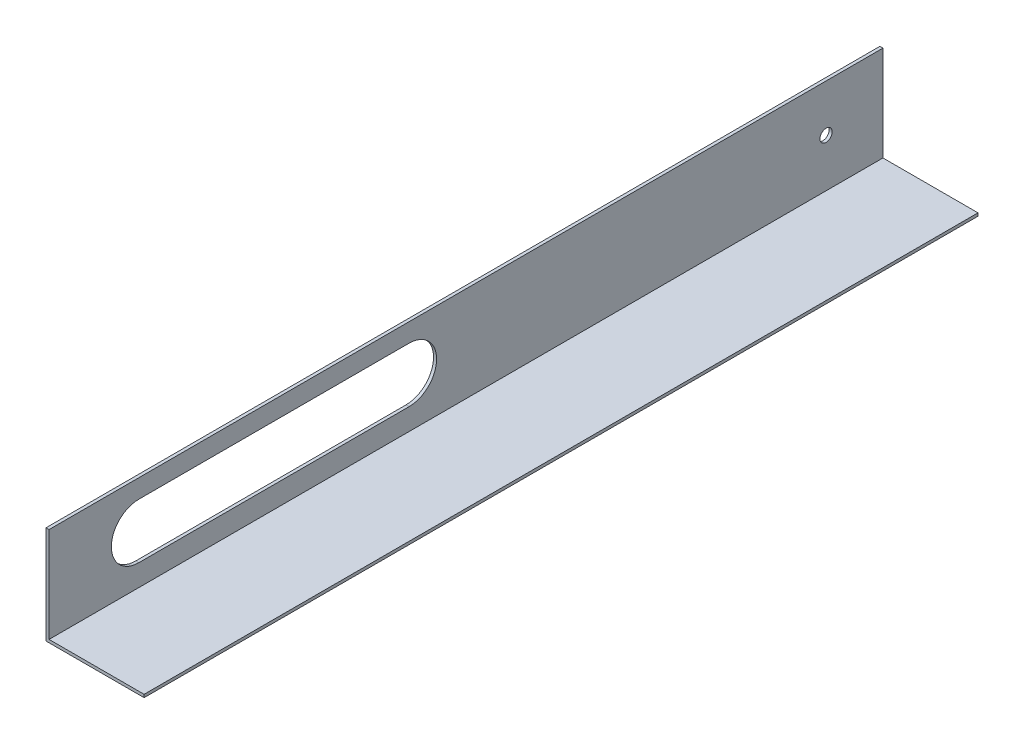
ISO-10303-21;
HEADER;
FILE_DESCRIPTION(('STEP AP214'),'2;1');
FILE_NAME('part.step','',(''),(''),'','','');
FILE_SCHEMA(('AUTOMOTIVE_DESIGN { 1 0 10303 214 1 1 1 1 }'));
ENDSEC;
DATA;
#1=APPLICATION_CONTEXT('core data for automotive mechanical design processes');
#2=APPLICATION_PROTOCOL_DEFINITION('international standard','automotive_design',2000,#1);
#3=PRODUCT_CONTEXT('',#1,'mechanical');
#4=PRODUCT('Part','Part','',(#3));
#5=PRODUCT_RELATED_PRODUCT_CATEGORY('part','',(#4));
#6=PRODUCT_DEFINITION_FORMATION('','',#4);
#7=PRODUCT_DEFINITION_CONTEXT('part definition',#1,'design');
#8=PRODUCT_DEFINITION('design','',#6,#7);
#9=PRODUCT_DEFINITION_SHAPE('','',#8);
#10=(LENGTH_UNIT() NAMED_UNIT(*) SI_UNIT(.MILLI.,.METRE.));
#11=(NAMED_UNIT(*) PLANE_ANGLE_UNIT() SI_UNIT($,.RADIAN.));
#12=(NAMED_UNIT(*) SI_UNIT($,.STERADIAN.) SOLID_ANGLE_UNIT());
#13=UNCERTAINTY_MEASURE_WITH_UNIT(LENGTH_MEASURE(1.E-05),#10,'distance_accuracy_value','');
#14=(GEOMETRIC_REPRESENTATION_CONTEXT(3) GLOBAL_UNCERTAINTY_ASSIGNED_CONTEXT((#13)) GLOBAL_UNIT_ASSIGNED_CONTEXT((#10,
#11,#12)) REPRESENTATION_CONTEXT('',''));
#15=CARTESIAN_POINT('',(0.,0.,0.));
#16=DIRECTION('',(0.,0.,1.));
#17=DIRECTION('',(1.,0.,0.));
#18=AXIS2_PLACEMENT_3D('',#15,#16,#17);
#19=CARTESIAN_POINT('',(100.0125,0.,431.8));
#20=DIRECTION('',(0.,1.,0.));
#21=DIRECTION('',(-1.,0.,0.));
#22=AXIS2_PLACEMENT_3D('',#19,#20,#21);
#23=PLANE('',#22);
#24=DIRECTION('',(1.,0.,0.));
#25=VECTOR('',#24,1.);
#26=CARTESIAN_POINT('',(100.0125,0.,0.));
#27=LINE('',#26,#25);
#28=CARTESIAN_POINT('',(49.2125,0.,0.));
#29=VERTEX_POINT('',#28);
#30=CARTESIAN_POINT('',(100.0125,0.,0.));
#31=VERTEX_POINT('',#30);
#32=EDGE_CURVE('E159',#29,#31,#27,.T.);
#33=ORIENTED_EDGE('',*,*,#32,.T.);
#34=DIRECTION('',(0.,0.,-1.));
#35=VECTOR('',#34,1.);
#36=CARTESIAN_POINT('',(100.0125,0.,431.8));
#37=LINE('',#36,#35);
#38=CARTESIAN_POINT('',(100.0125,0.,431.8));
#39=VERTEX_POINT('',#38);
#40=EDGE_CURVE('E181',#39,#31,#37,.T.);
#41=ORIENTED_EDGE('',*,*,#40,.F.);
#42=DIRECTION('',(1.,0.,0.));
#43=VECTOR('',#42,1.);
#44=CARTESIAN_POINT('',(100.0125,0.,431.8));
#45=LINE('',#44,#43);
#46=CARTESIAN_POINT('',(49.2125,0.,431.8));
#47=VERTEX_POINT('',#46);
#48=EDGE_CURVE('E146',#47,#39,#45,.T.);
#49=ORIENTED_EDGE('',*,*,#48,.F.);
#50=DIRECTION('',(0.,0.,-1.));
#51=VECTOR('',#50,1.);
#52=CARTESIAN_POINT('',(49.2125,0.,431.8));
#53=LINE('',#52,#51);
#54=EDGE_CURVE('E184',#47,#29,#53,.T.);
#55=ORIENTED_EDGE('',*,*,#54,.T.);
#56=EDGE_LOOP('',(#33,#41,#49,#55));
#57=FACE_BOUND('',#56,.T.);
#58=ADVANCED_FACE('F35',(#57),#23,.F.);
#59=CARTESIAN_POINT('',(100.0125,1.524,431.8));
#60=DIRECTION('',(-1.,0.,0.));
#61=DIRECTION('',(0.,0.,1.));
#62=AXIS2_PLACEMENT_3D('',#59,#60,#61);
#63=PLANE('',#62);
#64=DIRECTION('',(0.,1.,0.));
#65=VECTOR('',#64,1.);
#66=CARTESIAN_POINT('',(100.0125,1.524,0.));
#67=LINE('',#66,#65);
#68=CARTESIAN_POINT('',(100.0125,1.524,0.));
#69=VERTEX_POINT('',#68);
#70=EDGE_CURVE('E161',#31,#69,#67,.T.);
#71=ORIENTED_EDGE('',*,*,#70,.T.);
#72=DIRECTION('',(0.,0.,-1.));
#73=VECTOR('',#72,1.);
#74=CARTESIAN_POINT('',(100.0125,1.524,431.8));
#75=LINE('',#74,#73);
#76=CARTESIAN_POINT('',(100.0125,1.524,431.8));
#77=VERTEX_POINT('',#76);
#78=EDGE_CURVE('E178',#77,#69,#75,.T.);
#79=ORIENTED_EDGE('',*,*,#78,.F.);
#80=DIRECTION('',(0.,1.,0.));
#81=VECTOR('',#80,1.);
#82=CARTESIAN_POINT('',(100.0125,1.524,431.8));
#83=LINE('',#82,#81);
#84=EDGE_CURVE('E149',#39,#77,#83,.T.);
#85=ORIENTED_EDGE('',*,*,#84,.F.);
#86=ORIENTED_EDGE('',*,*,#40,.T.);
#87=EDGE_LOOP('',(#71,#79,#85,#86));
#88=FACE_BOUND('',#87,.T.);
#89=ADVANCED_FACE('F212',(#88),#63,.F.);
#90=CARTESIAN_POINT('',(50.8,1.524,431.8));
#91=DIRECTION('',(0.,-1.,0.));
#92=DIRECTION('',(1.,0.,0.));
#93=AXIS2_PLACEMENT_3D('',#90,#91,#92);
#94=PLANE('',#93);
#95=DIRECTION('',(-1.,0.,0.));
#96=VECTOR('',#95,1.);
#97=CARTESIAN_POINT('',(50.8,1.524,0.));
#98=LINE('',#97,#96);
#99=CARTESIAN_POINT('',(50.8,1.524,0.));
#100=VERTEX_POINT('',#99);
#101=EDGE_CURVE('E163',#69,#100,#98,.T.);
#102=ORIENTED_EDGE('',*,*,#101,.T.);
#103=DIRECTION('',(0.,0.,-1.));
#104=VECTOR('',#103,1.);
#105=CARTESIAN_POINT('',(50.8,1.524,431.8));
#106=LINE('',#105,#104);
#107=CARTESIAN_POINT('',(50.8,1.524,431.8));
#108=VERTEX_POINT('',#107);
#109=EDGE_CURVE('E175',#108,#100,#106,.T.);
#110=ORIENTED_EDGE('',*,*,#109,.F.);
#111=DIRECTION('',(-1.,0.,0.));
#112=VECTOR('',#111,1.);
#113=CARTESIAN_POINT('',(50.8,1.524,431.8));
#114=LINE('',#113,#112);
#115=EDGE_CURVE('E151',#77,#108,#114,.T.);
#116=ORIENTED_EDGE('',*,*,#115,.F.);
#117=ORIENTED_EDGE('',*,*,#78,.T.);
#118=EDGE_LOOP('',(#102,#110,#116,#117));
#119=FACE_BOUND('',#118,.T.);
#120=ADVANCED_FACE('F217',(#119),#94,.F.);
#121=CARTESIAN_POINT('',(50.8,50.8,431.8));
#122=DIRECTION('',(-1.,0.,0.));
#123=DIRECTION('',(0.,-1.,0.));
#124=AXIS2_PLACEMENT_3D('',#121,#122,#123);
#125=PLANE('',#124);
#126=DIRECTION('',(0.,0.,1.));
#127=VECTOR('',#126,1.);
#128=CARTESIAN_POINT('',(50.8,41.148,245.364));
#129=LINE('',#128,#127);
#130=CARTESIAN_POINT('',(50.8,41.148,245.364));
#131=VERTEX_POINT('',#130);
#132=CARTESIAN_POINT('',(50.8,41.148,385.318));
#133=VERTEX_POINT('',#132);
#134=EDGE_CURVE('E123',#131,#133,#129,.T.);
#135=ORIENTED_EDGE('',*,*,#134,.F.);
#136=CARTESIAN_POINT('',(50.8,26.924,245.364));
#137=DIRECTION('',(1.,0.,0.));
#138=DIRECTION('',(0.,0.,-1.));
#139=AXIS2_PLACEMENT_3D('',#136,#137,#138);
#140=CIRCLE('',#139,14.224);
#141=CARTESIAN_POINT('',(50.8,12.7,245.364));
#142=VERTEX_POINT('',#141);
#143=EDGE_CURVE('E49',#142,#131,#140,.T.);
#144=ORIENTED_EDGE('',*,*,#143,.F.);
#145=DIRECTION('',(0.,0.,-1.));
#146=VECTOR('',#145,1.);
#147=CARTESIAN_POINT('',(50.8,12.7,245.364));
#148=LINE('',#147,#146);
#149=CARTESIAN_POINT('',(50.8,12.7,385.318));
#150=VERTEX_POINT('',#149);
#151=EDGE_CURVE('E130',#150,#142,#148,.T.);
#152=ORIENTED_EDGE('',*,*,#151,.F.);
#153=CARTESIAN_POINT('',(50.8,26.924,385.318));
#154=DIRECTION('',(1.,0.,0.));
#155=DIRECTION('',(0.,0.,-1.));
#156=AXIS2_PLACEMENT_3D('',#153,#154,#155);
#157=CIRCLE('',#156,14.224);
#158=EDGE_CURVE('E114',#133,#150,#157,.T.);
#159=ORIENTED_EDGE('',*,*,#158,.F.);
#160=EDGE_LOOP('',(#135,#144,#152,#159));
#161=FACE_BOUND('',#160,.T.);
#162=CARTESIAN_POINT('',(50.8,26.416,29.464));
#163=DIRECTION('',(1.,0.,0.));
#164=DIRECTION('',(0.,0.,-1.));
#165=AXIS2_PLACEMENT_3D('',#162,#163,#164);
#166=CIRCLE('',#165,3.175);
#167=CARTESIAN_POINT('',(50.8,26.416,26.289));
#168=VERTEX_POINT('',#167);
#169=EDGE_CURVE('E140',#168,#168,#166,.T.);
#170=ORIENTED_EDGE('',*,*,#169,.F.);
#171=EDGE_LOOP('',(#170));
#172=FACE_BOUND('',#171,.T.);
#173=DIRECTION('',(0.,1.,0.));
#174=VECTOR('',#173,1.);
#175=CARTESIAN_POINT('',(50.8,50.8,0.));
#176=LINE('',#175,#174);
#177=CARTESIAN_POINT('',(50.8,50.8,0.));
#178=VERTEX_POINT('',#177);
#179=EDGE_CURVE('E165',#100,#178,#176,.T.);
#180=ORIENTED_EDGE('',*,*,#179,.T.);
#181=DIRECTION('',(0.,0.,-1.));
#182=VECTOR('',#181,1.);
#183=CARTESIAN_POINT('',(50.8,50.8,431.8));
#184=LINE('',#183,#182);
#185=CARTESIAN_POINT('',(50.8,50.8,431.8));
#186=VERTEX_POINT('',#185);
#187=EDGE_CURVE('E172',#186,#178,#184,.T.);
#188=ORIENTED_EDGE('',*,*,#187,.F.);
#189=DIRECTION('',(0.,1.,0.));
#190=VECTOR('',#189,1.);
#191=CARTESIAN_POINT('',(50.8,50.8,431.8));
#192=LINE('',#191,#190);
#193=EDGE_CURVE('E153',#108,#186,#192,.T.);
#194=ORIENTED_EDGE('',*,*,#193,.F.);
#195=ORIENTED_EDGE('',*,*,#109,.T.);
#196=EDGE_LOOP('',(#180,#188,#194,#195));
#197=FACE_BOUND('',#196,.T.);
#198=ADVANCED_FACE('F127',(#161,#172,#197),#125,.F.);
#199=CARTESIAN_POINT('',(49.2125,50.8,431.8));
#200=DIRECTION('',(0.,-1.,0.));
#201=DIRECTION('',(0.,0.,-1.));
#202=AXIS2_PLACEMENT_3D('',#199,#200,#201);
#203=PLANE('',#202);
#204=DIRECTION('',(-1.,0.,0.));
#205=VECTOR('',#204,1.);
#206=CARTESIAN_POINT('',(49.2125,50.8,0.));
#207=LINE('',#206,#205);
#208=CARTESIAN_POINT('',(49.2125,50.8,0.));
#209=VERTEX_POINT('',#208);
#210=EDGE_CURVE('E167',#178,#209,#207,.T.);
#211=ORIENTED_EDGE('',*,*,#210,.T.);
#212=DIRECTION('',(0.,0.,-1.));
#213=VECTOR('',#212,1.);
#214=CARTESIAN_POINT('',(49.2125,50.8,431.8));
#215=LINE('',#214,#213);
#216=CARTESIAN_POINT('',(49.2125,50.8,431.8));
#217=VERTEX_POINT('',#216);
#218=EDGE_CURVE('E158',#217,#209,#215,.T.);
#219=ORIENTED_EDGE('',*,*,#218,.F.);
#220=DIRECTION('',(-1.,0.,0.));
#221=VECTOR('',#220,1.);
#222=CARTESIAN_POINT('',(49.2125,50.8,431.8));
#223=LINE('',#222,#221);
#224=EDGE_CURVE('E155',#186,#217,#223,.T.);
#225=ORIENTED_EDGE('',*,*,#224,.F.);
#226=ORIENTED_EDGE('',*,*,#187,.T.);
#227=EDGE_LOOP('',(#211,#219,#225,#226));
#228=FACE_BOUND('',#227,.T.);
#229=ADVANCED_FACE('F242',(#228),#203,.F.);
#230=CARTESIAN_POINT('',(49.2125,1.58749999999999,431.8));
#231=DIRECTION('',(1.,0.,0.));
#232=DIRECTION('',(0.,0.,-1.));
#233=AXIS2_PLACEMENT_3D('',#230,#231,#232);
#234=PLANE('',#233);
#235=DIRECTION('',(0.,0.,-1.));
#236=VECTOR('',#235,1.);
#237=CARTESIAN_POINT('',(49.2125,12.7,431.8));
#238=LINE('',#237,#236);
#239=CARTESIAN_POINT('',(49.2125,12.7,385.318));
#240=VERTEX_POINT('',#239);
#241=CARTESIAN_POINT('',(49.2125,12.7,245.364));
#242=VERTEX_POINT('',#241);
#243=EDGE_CURVE('E42',#240,#242,#238,.T.);
#244=ORIENTED_EDGE('',*,*,#243,.T.);
#245=CARTESIAN_POINT('',(49.2125,26.924,245.364));
#246=DIRECTION('',(1.,0.,0.));
#247=DIRECTION('',(0.,0.,-1.));
#248=AXIS2_PLACEMENT_3D('',#245,#246,#247);
#249=CIRCLE('',#248,14.224);
#250=CARTESIAN_POINT('',(49.2125,41.148,245.364));
#251=VERTEX_POINT('',#250);
#252=EDGE_CURVE('E11',#242,#251,#249,.T.);
#253=ORIENTED_EDGE('',*,*,#252,.T.);
#254=DIRECTION('',(0.,0.,1.));
#255=VECTOR('',#254,1.);
#256=CARTESIAN_POINT('',(49.2125,41.148,431.8));
#257=LINE('',#256,#255);
#258=CARTESIAN_POINT('',(49.2125,41.148,385.318));
#259=VERTEX_POINT('',#258);
#260=EDGE_CURVE('E187',#251,#259,#257,.T.);
#261=ORIENTED_EDGE('',*,*,#260,.T.);
#262=CARTESIAN_POINT('',(49.2125,26.924,385.318));
#263=DIRECTION('',(1.,0.,0.));
#264=DIRECTION('',(0.,0.,-1.));
#265=AXIS2_PLACEMENT_3D('',#262,#263,#264);
#266=CIRCLE('',#265,14.224);
#267=EDGE_CURVE('E117',#259,#240,#266,.T.);
#268=ORIENTED_EDGE('',*,*,#267,.T.);
#269=EDGE_LOOP('',(#244,#253,#261,#268));
#270=FACE_BOUND('',#269,.T.);
#271=CARTESIAN_POINT('',(49.2125,26.416,29.464));
#272=DIRECTION('',(1.,0.,0.));
#273=DIRECTION('',(0.,0.,-1.));
#274=AXIS2_PLACEMENT_3D('',#271,#272,#273);
#275=CIRCLE('',#274,3.175);
#276=CARTESIAN_POINT('',(49.2125,26.416,26.289));
#277=VERTEX_POINT('',#276);
#278=EDGE_CURVE('E137',#277,#277,#275,.T.);
#279=ORIENTED_EDGE('',*,*,#278,.T.);
#280=EDGE_LOOP('',(#279));
#281=FACE_BOUND('',#280,.T.);
#282=DIRECTION('',(0.,-1.,0.));
#283=VECTOR('',#282,1.);
#284=CARTESIAN_POINT('',(49.2125,1.58749999999999,0.));
#285=LINE('',#284,#283);
#286=EDGE_CURVE('E147',#209,#29,#285,.T.);
#287=ORIENTED_EDGE('',*,*,#286,.T.);
#288=ORIENTED_EDGE('',*,*,#54,.F.);
#289=DIRECTION('',(0.,-1.,0.));
#290=VECTOR('',#289,1.);
#291=CARTESIAN_POINT('',(49.2125,0.,431.8));
#292=LINE('',#291,#290);
#293=EDGE_CURVE('E143',#217,#47,#292,.T.);
#294=ORIENTED_EDGE('',*,*,#293,.F.);
#295=ORIENTED_EDGE('',*,*,#218,.T.);
#296=EDGE_LOOP('',(#287,#288,#294,#295));
#297=FACE_BOUND('',#296,.T.);
#298=ADVANCED_FACE('F193',(#270,#281,#297),#234,.F.);
#299=CARTESIAN_POINT('',(0.,0.,431.8));
#300=DIRECTION('',(0.,0.,-1.));
#301=DIRECTION('',(-1.,0.,0.));
#302=AXIS2_PLACEMENT_3D('',#299,#300,#301);
#303=PLANE('',#302);
#304=ORIENTED_EDGE('',*,*,#293,.T.);
#305=ORIENTED_EDGE('',*,*,#48,.T.);
#306=ORIENTED_EDGE('',*,*,#84,.T.);
#307=ORIENTED_EDGE('',*,*,#115,.T.);
#308=ORIENTED_EDGE('',*,*,#193,.T.);
#309=ORIENTED_EDGE('',*,*,#224,.T.);
#310=EDGE_LOOP('',(#304,#305,#306,#307,#308,#309));
#311=FACE_BOUND('',#310,.T.);
#312=ADVANCED_FACE('F238',(#311),#303,.F.);
#313=CARTESIAN_POINT('',(0.,0.,0.));
#314=DIRECTION('',(0.,0.,-1.));
#315=DIRECTION('',(-1.,0.,0.));
#316=AXIS2_PLACEMENT_3D('',#313,#314,#315);
#317=PLANE('',#316);
#318=ORIENTED_EDGE('',*,*,#32,.F.);
#319=ORIENTED_EDGE('',*,*,#286,.F.);
#320=ORIENTED_EDGE('',*,*,#210,.F.);
#321=ORIENTED_EDGE('',*,*,#179,.F.);
#322=ORIENTED_EDGE('',*,*,#101,.F.);
#323=ORIENTED_EDGE('',*,*,#70,.F.);
#324=EDGE_LOOP('',(#318,#319,#320,#321,#322,#323));
#325=FACE_BOUND('',#324,.T.);
#326=ADVANCED_FACE('F207',(#325),#317,.T.);
#327=CARTESIAN_POINT('',(48.26,26.416,29.464));
#328=DIRECTION('',(1.,0.,0.));
#329=DIRECTION('',(0.,0.,-1.));
#330=AXIS2_PLACEMENT_3D('',#327,#328,#329);
#331=CYLINDRICAL_SURFACE('',#330,3.175);
#332=ORIENTED_EDGE('',*,*,#169,.T.);
#333=EDGE_LOOP('',(#332));
#334=FACE_BOUND('',#333,.T.);
#335=ORIENTED_EDGE('',*,*,#278,.F.);
#336=EDGE_LOOP('',(#335));
#337=FACE_BOUND('',#336,.T.);
#338=ADVANCED_FACE('F200',(#334,#337),#331,.F.);
#339=CARTESIAN_POINT('',(48.26,26.924,245.364));
#340=DIRECTION('',(1.,0.,0.));
#341=DIRECTION('',(0.,0.,-1.));
#342=AXIS2_PLACEMENT_3D('',#339,#340,#341);
#343=CYLINDRICAL_SURFACE('',#342,14.224);
#344=DIRECTION('',(1.,0.,0.));
#345=VECTOR('',#344,1.);
#346=CARTESIAN_POINT('',(48.26,12.7,245.364));
#347=LINE('',#346,#345);
#348=EDGE_CURVE('E135',#242,#142,#347,.T.);
#349=ORIENTED_EDGE('',*,*,#348,.T.);
#350=ORIENTED_EDGE('',*,*,#143,.T.);
#351=DIRECTION('',(1.,0.,0.));
#352=VECTOR('',#351,1.);
#353=CARTESIAN_POINT('',(48.26,41.148,245.364));
#354=LINE('',#353,#352);
#355=EDGE_CURVE('E120',#251,#131,#354,.T.);
#356=ORIENTED_EDGE('',*,*,#355,.F.);
#357=ORIENTED_EDGE('',*,*,#252,.F.);
#358=EDGE_LOOP('',(#349,#350,#356,#357));
#359=FACE_BOUND('',#358,.T.);
#360=ADVANCED_FACE('F198',(#359),#343,.F.);
#361=CARTESIAN_POINT('',(48.26,12.7,245.364));
#362=DIRECTION('',(0.,-1.,0.));
#363=DIRECTION('',(0.,0.,-1.));
#364=AXIS2_PLACEMENT_3D('',#361,#362,#363);
#365=PLANE('',#364);
#366=DIRECTION('',(1.,0.,0.));
#367=VECTOR('',#366,1.);
#368=CARTESIAN_POINT('',(48.26,12.7,385.318));
#369=LINE('',#368,#367);
#370=EDGE_CURVE('E119',#240,#150,#369,.T.);
#371=ORIENTED_EDGE('',*,*,#370,.T.);
#372=ORIENTED_EDGE('',*,*,#151,.T.);
#373=ORIENTED_EDGE('',*,*,#348,.F.);
#374=ORIENTED_EDGE('',*,*,#243,.F.);
#375=EDGE_LOOP('',(#371,#372,#373,#374));
#376=FACE_BOUND('',#375,.T.);
#377=ADVANCED_FACE('F197',(#376),#365,.F.);
#378=CARTESIAN_POINT('',(48.26,26.924,385.318));
#379=DIRECTION('',(1.,0.,0.));
#380=DIRECTION('',(0.,0.,-1.));
#381=AXIS2_PLACEMENT_3D('',#378,#379,#380);
#382=CYLINDRICAL_SURFACE('',#381,14.224);
#383=DIRECTION('',(1.,0.,0.));
#384=VECTOR('',#383,1.);
#385=CARTESIAN_POINT('',(48.26,41.148,385.318));
#386=LINE('',#385,#384);
#387=EDGE_CURVE('E57',#259,#133,#386,.T.);
#388=ORIENTED_EDGE('',*,*,#387,.T.);
#389=ORIENTED_EDGE('',*,*,#158,.T.);
#390=ORIENTED_EDGE('',*,*,#370,.F.);
#391=ORIENTED_EDGE('',*,*,#267,.F.);
#392=EDGE_LOOP('',(#388,#389,#390,#391));
#393=FACE_BOUND('',#392,.T.);
#394=ADVANCED_FACE('F111',(#393),#382,.F.);
#395=CARTESIAN_POINT('',(48.26,41.148,245.364));
#396=DIRECTION('',(0.,1.,0.));
#397=DIRECTION('',(0.,0.,1.));
#398=AXIS2_PLACEMENT_3D('',#395,#396,#397);
#399=PLANE('',#398);
#400=ORIENTED_EDGE('',*,*,#355,.T.);
#401=ORIENTED_EDGE('',*,*,#134,.T.);
#402=ORIENTED_EDGE('',*,*,#387,.F.);
#403=ORIENTED_EDGE('',*,*,#260,.F.);
#404=EDGE_LOOP('',(#400,#401,#402,#403));
#405=FACE_BOUND('',#404,.T.);
#406=ADVANCED_FACE('F124',(#405),#399,.F.);
#407=CLOSED_SHELL('',(#58,#89,#120,#198,#229,#298,#312,#326,#338,#360,#377,#394,#406));
#408=MANIFOLD_SOLID_BREP('B2',#407);
#409=ADVANCED_BREP_SHAPE_REPRESENTATION('',(#18,#408),#14);
#410=SHAPE_DEFINITION_REPRESENTATION(#9,#409);
ENDSEC;
END-ISO-10303-21;
